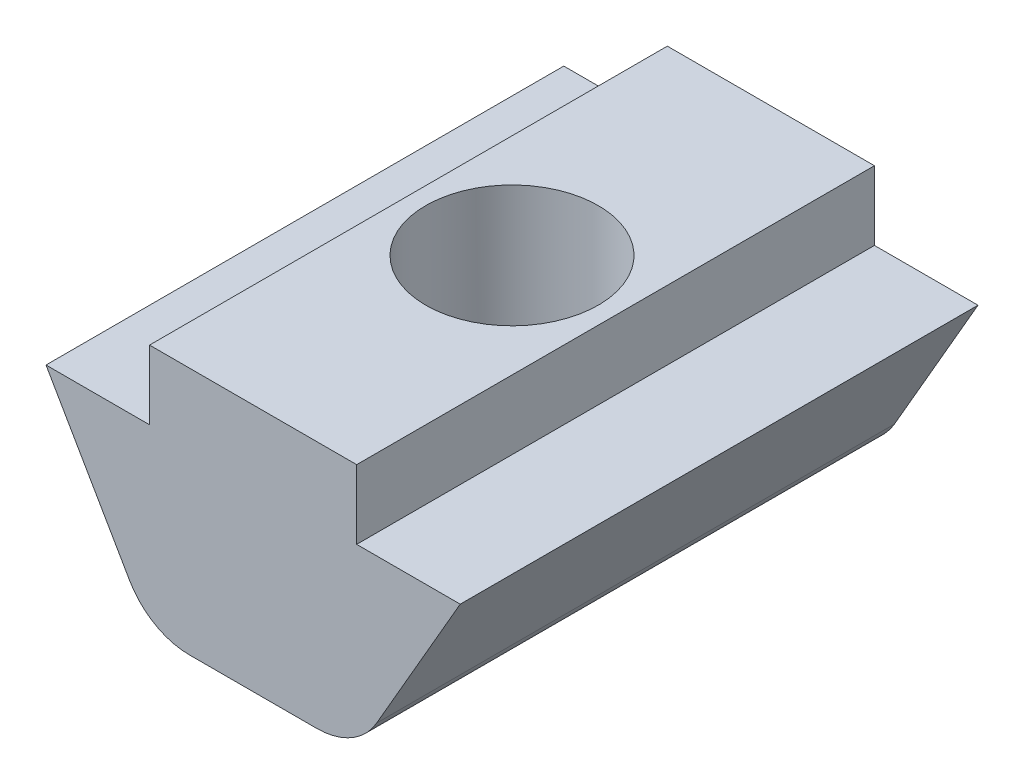
ISO-10303-21;
HEADER;
FILE_DESCRIPTION(('STEP AP214'),'2;1');
FILE_NAME('part.step','',(''),(''),'','','');
FILE_SCHEMA(('AUTOMOTIVE_DESIGN { 1 0 10303 214 1 1 1 1 }'));
ENDSEC;
DATA;
#1=APPLICATION_CONTEXT('core data for automotive mechanical design processes');
#2=APPLICATION_PROTOCOL_DEFINITION('international standard','automotive_design',2000,#1);
#3=PRODUCT_CONTEXT('',#1,'mechanical');
#4=PRODUCT('Part','Part','',(#3));
#5=PRODUCT_RELATED_PRODUCT_CATEGORY('part','',(#4));
#6=PRODUCT_DEFINITION_FORMATION('','',#4);
#7=PRODUCT_DEFINITION_CONTEXT('part definition',#1,'design');
#8=PRODUCT_DEFINITION('design','',#6,#7);
#9=PRODUCT_DEFINITION_SHAPE('','',#8);
#10=(LENGTH_UNIT() NAMED_UNIT(*) SI_UNIT(.MILLI.,.METRE.));
#11=(NAMED_UNIT(*) PLANE_ANGLE_UNIT() SI_UNIT($,.RADIAN.));
#12=(NAMED_UNIT(*) SI_UNIT($,.STERADIAN.) SOLID_ANGLE_UNIT());
#13=UNCERTAINTY_MEASURE_WITH_UNIT(LENGTH_MEASURE(1.E-05),#10,'distance_accuracy_value','');
#14=(GEOMETRIC_REPRESENTATION_CONTEXT(3) GLOBAL_UNCERTAINTY_ASSIGNED_CONTEXT((#13)) GLOBAL_UNIT_ASSIGNED_CONTEXT((#10,
#11,#12)) REPRESENTATION_CONTEXT('',''));
#15=CARTESIAN_POINT('',(0.,0.,0.));
#16=DIRECTION('',(0.,0.,1.));
#17=DIRECTION('',(1.,0.,0.));
#18=AXIS2_PLACEMENT_3D('',#15,#16,#17);
#19=CARTESIAN_POINT('',(0.,0.,7.5));
#20=DIRECTION('',(0.,1.,0.));
#21=DIRECTION('',(0.,0.,1.));
#22=AXIS2_PLACEMENT_3D('',#19,#20,#21);
#23=PLANE('',#22);
#24=DIRECTION('',(1.,0.,0.));
#25=VECTOR('',#24,1.);
#26=CARTESIAN_POINT('',(0.,0.,-7.5));
#27=LINE('',#26,#25);
#28=CARTESIAN_POINT('',(-1.84529946162075,0.,-7.5));
#29=VERTEX_POINT('',#28);
#30=CARTESIAN_POINT('',(1.84529946162075,0.,-7.5));
#31=VERTEX_POINT('',#30);
#32=EDGE_CURVE('E165',#29,#31,#27,.T.);
#33=ORIENTED_EDGE('',*,*,#32,.T.);
#34=DIRECTION('',(0.,0.,-1.));
#35=VECTOR('',#34,1.);
#36=CARTESIAN_POINT('',(1.84529946162075,0.,7.5));
#37=LINE('',#36,#35);
#38=CARTESIAN_POINT('',(1.84529946162075,0.,-1.68667421185662));
#39=VERTEX_POINT('',#38);
#40=EDGE_CURVE('E222',#31,#39,#37,.F.);
#41=ORIENTED_EDGE('',*,*,#40,.T.);
#42=CARTESIAN_POINT('',(0.,0.,0.));
#43=DIRECTION('',(0.,1.,0.));
#44=DIRECTION('',(0.,0.,1.));
#45=AXIS2_PLACEMENT_3D('',#42,#43,#44);
#46=CIRCLE('',#45,2.5);
#47=CARTESIAN_POINT('',(-1.84529946162075,0.,-1.68667421185662));
#48=VERTEX_POINT('',#47);
#49=EDGE_CURVE('E186',#39,#48,#46,.T.);
#50=ORIENTED_EDGE('',*,*,#49,.T.);
#51=DIRECTION('',(0.,0.,-1.));
#52=VECTOR('',#51,1.);
#53=CARTESIAN_POINT('',(-1.84529946162075,0.,-7.5));
#54=LINE('',#53,#52);
#55=EDGE_CURVE('E216',#48,#29,#54,.T.);
#56=ORIENTED_EDGE('',*,*,#55,.T.);
#57=EDGE_LOOP('',(#33,#41,#50,#56));
#58=FACE_BOUND('',#57,.T.);
#59=ADVANCED_FACE('F47',(#58),#23,.F.);
#60=CARTESIAN_POINT('',(0.,5.19615242270662,7.5));
#61=DIRECTION('',(0.,1.,0.));
#62=DIRECTION('',(-1.,0.,0.));
#63=AXIS2_PLACEMENT_3D('',#60,#61,#62);
#64=PLANE('',#63);
#65=DIRECTION('',(1.,0.,0.));
#66=VECTOR('',#65,1.);
#67=CARTESIAN_POINT('',(0.,5.19615242270662,-7.5));
#68=LINE('',#67,#66);
#69=CARTESIAN_POINT('',(3.,5.19615242270662,-7.5));
#70=VERTEX_POINT('',#69);
#71=CARTESIAN_POINT('',(6.00000000000002,5.19615242270662,-7.5));
#72=VERTEX_POINT('',#71);
#73=EDGE_CURVE('E145',#70,#72,#68,.T.);
#74=ORIENTED_EDGE('',*,*,#73,.F.);
#75=DIRECTION('',(0.,0.,-1.));
#76=VECTOR('',#75,1.);
#77=CARTESIAN_POINT('',(3.,5.19615242270662,7.5));
#78=LINE('',#77,#76);
#79=CARTESIAN_POINT('',(3.,5.19615242270662,7.5));
#80=VERTEX_POINT('',#79);
#81=EDGE_CURVE('E138',#80,#70,#78,.T.);
#82=ORIENTED_EDGE('',*,*,#81,.F.);
#83=DIRECTION('',(1.,0.,0.));
#84=VECTOR('',#83,1.);
#85=CARTESIAN_POINT('',(0.,5.19615242270662,7.5));
#86=LINE('',#85,#84);
#87=CARTESIAN_POINT('',(6.00000000000002,5.19615242270662,7.5));
#88=VERTEX_POINT('',#87);
#89=EDGE_CURVE('E143',#80,#88,#86,.T.);
#90=ORIENTED_EDGE('',*,*,#89,.T.);
#91=DIRECTION('',(0.,0.,-1.));
#92=VECTOR('',#91,1.);
#93=CARTESIAN_POINT('',(6.00000000000002,5.19615242270662,7.5));
#94=LINE('',#93,#92);
#95=EDGE_CURVE('E183',#88,#72,#94,.T.);
#96=ORIENTED_EDGE('',*,*,#95,.T.);
#97=EDGE_LOOP('',(#74,#82,#90,#96));
#98=FACE_BOUND('',#97,.T.);
#99=ADVANCED_FACE('F140',(#98),#64,.T.);
#100=CARTESIAN_POINT('',(3.,0.,7.5));
#101=DIRECTION('',(-1.,0.,0.));
#102=DIRECTION('',(0.,-1.,0.));
#103=AXIS2_PLACEMENT_3D('',#100,#101,#102);
#104=PLANE('',#103);
#105=DIRECTION('',(0.,1.,0.));
#106=VECTOR('',#105,1.);
#107=CARTESIAN_POINT('',(3.,0.,-7.5));
#108=LINE('',#107,#106);
#109=CARTESIAN_POINT('',(3.,7.19615242270662,-7.5));
#110=VERTEX_POINT('',#109);
#111=EDGE_CURVE('E185',#70,#110,#108,.T.);
#112=ORIENTED_EDGE('',*,*,#111,.T.);
#113=DIRECTION('',(0.,0.,-1.));
#114=VECTOR('',#113,1.);
#115=CARTESIAN_POINT('',(3.,7.19615242270662,7.5));
#116=LINE('',#115,#114);
#117=CARTESIAN_POINT('',(3.,7.19615242270662,7.5));
#118=VERTEX_POINT('',#117);
#119=EDGE_CURVE('E149',#118,#110,#116,.T.);
#120=ORIENTED_EDGE('',*,*,#119,.F.);
#121=DIRECTION('',(0.,1.,0.));
#122=VECTOR('',#121,1.);
#123=CARTESIAN_POINT('',(3.,0.,7.5));
#124=LINE('',#123,#122);
#125=EDGE_CURVE('E152',#80,#118,#124,.T.);
#126=ORIENTED_EDGE('',*,*,#125,.F.);
#127=ORIENTED_EDGE('',*,*,#81,.T.);
#128=EDGE_LOOP('',(#112,#120,#126,#127));
#129=FACE_BOUND('',#128,.T.);
#130=ADVANCED_FACE('F153',(#129),#104,.F.);
#131=CARTESIAN_POINT('',(0.,7.19615242270662,7.5));
#132=DIRECTION('',(0.,-1.,0.));
#133=DIRECTION('',(1.,0.,0.));
#134=AXIS2_PLACEMENT_3D('',#131,#132,#133);
#135=PLANE('',#134);
#136=CARTESIAN_POINT('',(0.,7.19615242270662,0.));
#137=DIRECTION('',(0.,1.,0.));
#138=DIRECTION('',(0.,0.,1.));
#139=AXIS2_PLACEMENT_3D('',#136,#137,#138);
#140=CIRCLE('',#139,2.5);
#141=CARTESIAN_POINT('',(0.,7.19615242270662,2.5));
#142=VERTEX_POINT('',#141);
#143=EDGE_CURVE('E311',#142,#142,#140,.T.);
#144=ORIENTED_EDGE('',*,*,#143,.F.);
#145=EDGE_LOOP('',(#144));
#146=FACE_BOUND('',#145,.T.);
#147=DIRECTION('',(-1.,0.,0.));
#148=VECTOR('',#147,1.);
#149=CARTESIAN_POINT('',(0.,7.19615242270662,-7.5));
#150=LINE('',#149,#148);
#151=CARTESIAN_POINT('',(-3.,7.19615242270662,-7.5));
#152=VERTEX_POINT('',#151);
#153=EDGE_CURVE('E188',#110,#152,#150,.T.);
#154=ORIENTED_EDGE('',*,*,#153,.T.);
#155=DIRECTION('',(0.,0.,-1.));
#156=VECTOR('',#155,1.);
#157=CARTESIAN_POINT('',(-3.,7.19615242270662,7.5));
#158=LINE('',#157,#156);
#159=CARTESIAN_POINT('',(-3.,7.19615242270662,7.5));
#160=VERTEX_POINT('',#159);
#161=EDGE_CURVE('E207',#160,#152,#158,.T.);
#162=ORIENTED_EDGE('',*,*,#161,.F.);
#163=DIRECTION('',(-1.,0.,0.));
#164=VECTOR('',#163,1.);
#165=CARTESIAN_POINT('',(0.,7.19615242270662,7.5));
#166=LINE('',#165,#164);
#167=EDGE_CURVE('E157',#118,#160,#166,.T.);
#168=ORIENTED_EDGE('',*,*,#167,.F.);
#169=ORIENTED_EDGE('',*,*,#119,.T.);
#170=EDGE_LOOP('',(#154,#162,#168,#169));
#171=FACE_BOUND('',#170,.T.);
#172=ADVANCED_FACE('F267',(#146,#171),#135,.F.);
#173=CARTESIAN_POINT('',(-3.,0.,7.5));
#174=DIRECTION('',(-1.,0.,0.));
#175=DIRECTION('',(0.,0.,1.));
#176=AXIS2_PLACEMENT_3D('',#173,#174,#175);
#177=PLANE('',#176);
#178=DIRECTION('',(0.,1.,0.));
#179=VECTOR('',#178,1.);
#180=CARTESIAN_POINT('',(-3.,0.,-7.5));
#181=LINE('',#180,#179);
#182=CARTESIAN_POINT('',(-3.,5.19615242270662,-7.5));
#183=VERTEX_POINT('',#182);
#184=EDGE_CURVE('E191',#183,#152,#181,.T.);
#185=ORIENTED_EDGE('',*,*,#184,.F.);
#186=DIRECTION('',(0.,0.,-1.));
#187=VECTOR('',#186,1.);
#188=CARTESIAN_POINT('',(-3.,5.19615242270662,7.5));
#189=LINE('',#188,#187);
#190=CARTESIAN_POINT('',(-3.,5.19615242270662,7.5));
#191=VERTEX_POINT('',#190);
#192=EDGE_CURVE('E205',#191,#183,#189,.T.);
#193=ORIENTED_EDGE('',*,*,#192,.F.);
#194=DIRECTION('',(0.,1.,0.));
#195=VECTOR('',#194,1.);
#196=CARTESIAN_POINT('',(-3.,0.,7.5));
#197=LINE('',#196,#195);
#198=EDGE_CURVE('E172',#191,#160,#197,.T.);
#199=ORIENTED_EDGE('',*,*,#198,.T.);
#200=ORIENTED_EDGE('',*,*,#161,.T.);
#201=EDGE_LOOP('',(#185,#193,#199,#200));
#202=FACE_BOUND('',#201,.T.);
#203=ADVANCED_FACE('F263',(#202),#177,.T.);
#204=CARTESIAN_POINT('',(0.,5.19615242270662,7.5));
#205=DIRECTION('',(0.,1.,0.));
#206=DIRECTION('',(-1.,0.,0.));
#207=AXIS2_PLACEMENT_3D('',#204,#205,#206);
#208=PLANE('',#207);
#209=DIRECTION('',(1.,0.,0.));
#210=VECTOR('',#209,1.);
#211=CARTESIAN_POINT('',(0.,5.19615242270662,-7.5));
#212=LINE('',#211,#210);
#213=CARTESIAN_POINT('',(-6.00000000000002,5.19615242270662,-7.5));
#214=VERTEX_POINT('',#213);
#215=EDGE_CURVE('E194',#214,#183,#212,.T.);
#216=ORIENTED_EDGE('',*,*,#215,.F.);
#217=DIRECTION('',(0.,0.,-1.));
#218=VECTOR('',#217,1.);
#219=CARTESIAN_POINT('',(-6.00000000000002,5.19615242270662,7.5));
#220=LINE('',#219,#218);
#221=CARTESIAN_POINT('',(-6.00000000000002,5.19615242270662,7.5));
#222=VERTEX_POINT('',#221);
#223=EDGE_CURVE('E202',#222,#214,#220,.T.);
#224=ORIENTED_EDGE('',*,*,#223,.F.);
#225=DIRECTION('',(1.,0.,0.));
#226=VECTOR('',#225,1.);
#227=CARTESIAN_POINT('',(0.,5.19615242270662,7.5));
#228=LINE('',#227,#226);
#229=EDGE_CURVE('E175',#222,#191,#228,.T.);
#230=ORIENTED_EDGE('',*,*,#229,.T.);
#231=ORIENTED_EDGE('',*,*,#192,.T.);
#232=EDGE_LOOP('',(#216,#224,#230,#231));
#233=FACE_BOUND('',#232,.T.);
#234=ADVANCED_FACE('F260',(#233),#208,.T.);
#235=CARTESIAN_POINT('',(-2.24999999999999,-1.29903810567666,7.5));
#236=DIRECTION('',(-0.866025403784436,-0.500000000000004,0.));
#237=DIRECTION('',(0.500000000000004,-0.866025403784436,0.));
#238=AXIS2_PLACEMENT_3D('',#235,#236,#237);
#239=PLANE('',#238);
#240=DIRECTION('',(-0.500000000000004,0.866025403784436,0.));
#241=VECTOR('',#240,1.);
#242=CARTESIAN_POINT('',(-2.24999999999999,-1.29903810567666,-7.5));
#243=LINE('',#242,#241);
#244=CARTESIAN_POINT('',(-3.57735026918963,0.999999999999992,-7.5));
#245=VERTEX_POINT('',#244);
#246=EDGE_CURVE('E197',#245,#214,#243,.T.);
#247=ORIENTED_EDGE('',*,*,#246,.F.);
#248=DIRECTION('',(0.,0.,-1.));
#249=VECTOR('',#248,1.);
#250=CARTESIAN_POINT('',(-3.57735026918963,0.999999999999992,7.5));
#251=LINE('',#250,#249);
#252=CARTESIAN_POINT('',(-3.57735026918963,0.999999999999992,7.5));
#253=VERTEX_POINT('',#252);
#254=EDGE_CURVE('E11',#245,#253,#251,.F.);
#255=ORIENTED_EDGE('',*,*,#254,.T.);
#256=DIRECTION('',(-0.500000000000004,0.866025403784436,0.));
#257=VECTOR('',#256,1.);
#258=CARTESIAN_POINT('',(-2.24999999999999,-1.29903810567666,7.5));
#259=LINE('',#258,#257);
#260=EDGE_CURVE('E178',#253,#222,#259,.T.);
#261=ORIENTED_EDGE('',*,*,#260,.T.);
#262=ORIENTED_EDGE('',*,*,#223,.T.);
#263=EDGE_LOOP('',(#247,#255,#261,#262));
#264=FACE_BOUND('',#263,.T.);
#265=ADVANCED_FACE('F257',(#264),#239,.T.);
#266=CARTESIAN_POINT('',(-1.84529946162075,0.,1.68667421185662));
#267=VERTEX_POINT('',#266);
#268=CARTESIAN_POINT('',(1.84529946162075,0.,1.68667421185662));
#269=VERTEX_POINT('',#268);
#270=EDGE_CURVE('E168',#267,#269,#46,.T.);
#271=ORIENTED_EDGE('',*,*,#270,.T.);
#272=DIRECTION('',(0.,0.,-1.));
#273=VECTOR('',#272,1.);
#274=CARTESIAN_POINT('',(1.84529946162075,0.,7.5));
#275=LINE('',#274,#273);
#276=CARTESIAN_POINT('',(1.84529946162075,0.,7.5));
#277=VERTEX_POINT('',#276);
#278=EDGE_CURVE('E69',#269,#277,#275,.F.);
#279=ORIENTED_EDGE('',*,*,#278,.T.);
#280=DIRECTION('',(1.,0.,0.));
#281=VECTOR('',#280,1.);
#282=CARTESIAN_POINT('',(0.,0.,7.5));
#283=LINE('',#282,#281);
#284=CARTESIAN_POINT('',(-1.84529946162075,0.,7.5));
#285=VERTEX_POINT('',#284);
#286=EDGE_CURVE('E180',#285,#277,#283,.T.);
#287=ORIENTED_EDGE('',*,*,#286,.F.);
#288=DIRECTION('',(0.,0.,-1.));
#289=VECTOR('',#288,1.);
#290=CARTESIAN_POINT('',(-1.84529946162075,0.,-7.5));
#291=LINE('',#290,#289);
#292=EDGE_CURVE('E218',#285,#267,#291,.T.);
#293=ORIENTED_EDGE('',*,*,#292,.T.);
#294=EDGE_LOOP('',(#271,#279,#287,#293));
#295=FACE_BOUND('',#294,.T.);
#296=ADVANCED_FACE('F253',(#295),#23,.F.);
#297=CARTESIAN_POINT('',(2.24999999999999,-1.29903810567666,7.5));
#298=DIRECTION('',(-0.866025403784436,0.500000000000004,0.));
#299=DIRECTION('',(-0.500000000000004,-0.866025403784436,0.));
#300=AXIS2_PLACEMENT_3D('',#297,#298,#299);
#301=PLANE('',#300);
#302=DIRECTION('',(0.500000000000004,0.866025403784436,0.));
#303=VECTOR('',#302,1.);
#304=CARTESIAN_POINT('',(2.24999999999999,-1.29903810567666,7.5));
#305=LINE('',#304,#303);
#306=CARTESIAN_POINT('',(3.57735026918963,0.999999999999993,7.5));
#307=VERTEX_POINT('',#306);
#308=EDGE_CURVE('E161',#307,#88,#305,.T.);
#309=ORIENTED_EDGE('',*,*,#308,.F.);
#310=DIRECTION('',(0.,0.,-1.));
#311=VECTOR('',#310,1.);
#312=CARTESIAN_POINT('',(3.57735026918963,0.999999999999992,7.5));
#313=LINE('',#312,#311);
#314=CARTESIAN_POINT('',(3.57735026918963,0.999999999999993,-7.5));
#315=VERTEX_POINT('',#314);
#316=EDGE_CURVE('E148',#307,#315,#313,.T.);
#317=ORIENTED_EDGE('',*,*,#316,.T.);
#318=DIRECTION('',(0.500000000000004,0.866025403784436,0.));
#319=VECTOR('',#318,1.);
#320=CARTESIAN_POINT('',(2.24999999999999,-1.29903810567666,-7.5));
#321=LINE('',#320,#319);
#322=EDGE_CURVE('E163',#315,#72,#321,.T.);
#323=ORIENTED_EDGE('',*,*,#322,.T.);
#324=ORIENTED_EDGE('',*,*,#95,.F.);
#325=EDGE_LOOP('',(#309,#317,#323,#324));
#326=FACE_BOUND('',#325,.T.);
#327=ADVANCED_FACE('F247',(#326),#301,.F.);
#328=CARTESIAN_POINT('',(0.,0.,7.5));
#329=DIRECTION('',(0.,0.,1.));
#330=DIRECTION('',(1.,0.,0.));
#331=AXIS2_PLACEMENT_3D('',#328,#329,#330);
#332=PLANE('',#331);
#333=ORIENTED_EDGE('',*,*,#286,.T.);
#334=CARTESIAN_POINT('',(1.84529946162075,2.,7.5));
#335=DIRECTION('',(0.,0.,1.));
#336=DIRECTION('',(1.,0.,0.));
#337=AXIS2_PLACEMENT_3D('',#334,#335,#336);
#338=CIRCLE('',#337,2.);
#339=EDGE_CURVE('E56',#277,#307,#338,.T.);
#340=ORIENTED_EDGE('',*,*,#339,.T.);
#341=ORIENTED_EDGE('',*,*,#308,.T.);
#342=ORIENTED_EDGE('',*,*,#89,.F.);
#343=ORIENTED_EDGE('',*,*,#125,.T.);
#344=ORIENTED_EDGE('',*,*,#167,.T.);
#345=ORIENTED_EDGE('',*,*,#198,.F.);
#346=ORIENTED_EDGE('',*,*,#229,.F.);
#347=ORIENTED_EDGE('',*,*,#260,.F.);
#348=CARTESIAN_POINT('',(-1.84529946162075,2.,7.5));
#349=DIRECTION('',(0.,0.,1.));
#350=DIRECTION('',(1.,0.,0.));
#351=AXIS2_PLACEMENT_3D('',#348,#349,#350);
#352=CIRCLE('',#351,2.);
#353=EDGE_CURVE('E298',#253,#285,#352,.T.);
#354=ORIENTED_EDGE('',*,*,#353,.T.);
#355=EDGE_LOOP('',(#333,#340,#341,#342,#343,#344,#345,#346,#347,#354));
#356=FACE_BOUND('',#355,.T.);
#357=ADVANCED_FACE('F159',(#356),#332,.T.);
#358=CARTESIAN_POINT('',(0.,0.,-7.5));
#359=DIRECTION('',(0.,0.,1.));
#360=DIRECTION('',(1.,0.,0.));
#361=AXIS2_PLACEMENT_3D('',#358,#359,#360);
#362=PLANE('',#361);
#363=ORIENTED_EDGE('',*,*,#322,.F.);
#364=CARTESIAN_POINT('',(1.84529946162075,2.,-7.5));
#365=DIRECTION('',(0.,0.,1.));
#366=DIRECTION('',(1.,0.,0.));
#367=AXIS2_PLACEMENT_3D('',#364,#365,#366);
#368=CIRCLE('',#367,2.);
#369=EDGE_CURVE('E214',#315,#31,#368,.F.);
#370=ORIENTED_EDGE('',*,*,#369,.T.);
#371=ORIENTED_EDGE('',*,*,#32,.F.);
#372=CARTESIAN_POINT('',(-1.84529946162075,2.,-7.5));
#373=DIRECTION('',(0.,0.,1.));
#374=DIRECTION('',(1.,0.,0.));
#375=AXIS2_PLACEMENT_3D('',#372,#373,#374);
#376=CIRCLE('',#375,2.);
#377=EDGE_CURVE('E212',#29,#245,#376,.F.);
#378=ORIENTED_EDGE('',*,*,#377,.T.);
#379=ORIENTED_EDGE('',*,*,#246,.T.);
#380=ORIENTED_EDGE('',*,*,#215,.T.);
#381=ORIENTED_EDGE('',*,*,#184,.T.);
#382=ORIENTED_EDGE('',*,*,#153,.F.);
#383=ORIENTED_EDGE('',*,*,#111,.F.);
#384=ORIENTED_EDGE('',*,*,#73,.T.);
#385=EDGE_LOOP('',(#363,#370,#371,#378,#379,#380,#381,#382,#383,#384));
#386=FACE_BOUND('',#385,.T.);
#387=ADVANCED_FACE('F242',(#386),#362,.F.);
#388=CARTESIAN_POINT('',(0.,7.19615242270662,0.));
#389=DIRECTION('',(0.,1.,0.));
#390=DIRECTION('',(0.,0.,1.));
#391=AXIS2_PLACEMENT_3D('',#388,#389,#390);
#392=CYLINDRICAL_SURFACE('',#391,2.5);
#393=ORIENTED_EDGE('',*,*,#49,.F.);
#394=CARTESIAN_POINT('',(1.84529946162075,0.,-1.68667421185662));
#395=CARTESIAN_POINT('',(1.89166208323592,6.02253034148748E-06,-1.63596244512052));
#396=CARTESIAN_POINT('',(1.93589660748271,0.00161163772368976,-1.58335834786107));
#397=CARTESIAN_POINT('',(2.01980908200873,0.00718323127973132,-1.47480981559388));
#398=CARTESIAN_POINT('',(2.0594905410737,0.0111473772857666,-1.41886800400017));
#399=CARTESIAN_POINT('',(2.13408202895476,0.0206014322045704,-1.30398878641697));
#400=CARTESIAN_POINT('',(2.16899042167147,0.0260918623468122,-1.24505036270606));
#401=CARTESIAN_POINT('',(2.23383052337675,0.0378263561087073,-1.12458415115544));
#402=CARTESIAN_POINT('',(2.26376126032835,0.0440705665167027,-1.06305586049909));
#403=CARTESIAN_POINT('',(2.34573911107062,0.0628025924692854,-0.875267125826667));
#404=CARTESIAN_POINT('',(2.39015429797694,0.0753199553636141,-0.745521279566222));
#405=CARTESIAN_POINT('',(2.44043963674816,0.0905241384865065,-0.546759724949087));
#406=CARTESIAN_POINT('',(2.45447855824454,0.0949969116781946,-0.479814834995023));
#407=CARTESIAN_POINT('',(2.47703347102168,0.102354713803054,-0.344920949647073));
#408=CARTESIAN_POINT('',(2.48555203999688,0.105240483682167,-0.276972438070001));
#409=CARTESIAN_POINT('',(2.49705711156809,0.109167150133622,-0.139689126563732));
#410=CARTESIAN_POINT('',(2.49997200718607,0.110184159452673,-0.07034767875794));
#411=CARTESIAN_POINT('',(2.50002758950487,0.110203442754377,0.068339426252214));
#412=CARTESIAN_POINT('',(2.49716817303453,0.10920568073858,0.13768508350965));
#413=CARTESIAN_POINT('',(2.4856973549221,0.105289462119004,0.275898198810731));
#414=CARTESIAN_POINT('',(2.47708164180493,0.10236956585784,0.344765259289742));
#415=CARTESIAN_POINT('',(2.45417973905657,0.0949002747487914,0.481467878326858));
#416=CARTESIAN_POINT('',(2.43989150022439,0.0903502910895572,0.549303054911478));
#417=CARTESIAN_POINT('',(2.3898063345361,0.0752317111676149,0.746141620800277));
#418=CARTESIAN_POINT('',(2.34638077699403,0.0630090453448606,0.873149691266596));
#419=CARTESIAN_POINT('',(2.23987257271947,0.0385549560441308,1.11840252533905));
#420=CARTESIAN_POINT('',(2.17681981563771,0.0263235739097326,1.23666027786064));
#421=CARTESIAN_POINT('',(2.06636894848399,0.0118815071581746,1.40895557432785));
#422=CARTESIAN_POINT('',(2.02551438984066,0.00766209269895628,1.46708264648664));
#423=CARTESIAN_POINT('',(1.93896874268972,0.00172549239337327,1.57969819357611));
#424=CARTESIAN_POINT('',(1.89328016062795,7.01656213483229E-06,1.63418853048663));
#425=CARTESIAN_POINT('',(1.84529946162076,0.,1.68667421185662));
#426=B_SPLINE_CURVE_WITH_KNOTS('',3,(#394,#395,#396,#397,#398,#399,#400,#401,#402,#403,#404,
#405,#406,#407,#408,#409,#410,#411,#412,#413,#414,#415,#416,#417,#418,#419,#420,#421,#422,#423,
#424,#425),.UNSPECIFIED.,.F.,.F.,(4,2,2,2,2,2,2,2,2,2,2,2,2,2,2,4),(0.,0.205998426597717,
0.411837020388377,0.617745995060499,0.823695132555702,1.23459414978837,1.44004707713748,
1.64540400025623,1.85336809088125,2.06133589728824,2.26945964679068,2.47765864955023,
2.88015660068141,3.28204457440841,3.49529530786595,3.70843600750046),.UNSPECIFIED.);
#427=EDGE_CURVE('E231',#39,#269,#426,.T.);
#428=ORIENTED_EDGE('',*,*,#427,.T.);
#429=ORIENTED_EDGE('',*,*,#270,.F.);
#430=CARTESIAN_POINT('',(-1.84529946162075,0.,1.68667421185662));
#431=CARTESIAN_POINT('',(-1.89166208323592,6.02253034144555E-06,1.63596244512052));
#432=CARTESIAN_POINT('',(-1.93589660748271,0.00161163772368984,1.58335834786107));
#433=CARTESIAN_POINT('',(-2.01980908200873,0.0071832312797316,1.47480981559388));
#434=CARTESIAN_POINT('',(-2.0594905410737,0.0111473772857669,1.41886800400017));
#435=CARTESIAN_POINT('',(-2.13408202895476,0.0206014322045706,1.30398878641697));
#436=CARTESIAN_POINT('',(-2.16899042167147,0.0260918623468121,1.24505036270606));
#437=CARTESIAN_POINT('',(-2.23383052337675,0.0378263561087072,1.12458415115544));
#438=CARTESIAN_POINT('',(-2.26376126032835,0.0440705665167028,1.06305586049909));
#439=CARTESIAN_POINT('',(-2.34573911107062,0.0628025924692857,0.875267125826665));
#440=CARTESIAN_POINT('',(-2.39015429797694,0.0753199553636139,0.74552127956622));
#441=CARTESIAN_POINT('',(-2.44043963674816,0.0905241384865064,0.546759724949085));
#442=CARTESIAN_POINT('',(-2.45447855824453,0.0949969116781946,0.479814834995022));
#443=CARTESIAN_POINT('',(-2.47703347102168,0.102354713803054,0.344920949647072));
#444=CARTESIAN_POINT('',(-2.48555203999688,0.105240483682167,0.276972438069999));
#445=CARTESIAN_POINT('',(-2.49705711156809,0.109167150133622,0.13968912656373));
#446=CARTESIAN_POINT('',(-2.49997200718607,0.110184159452673,0.0703476787579383));
#447=CARTESIAN_POINT('',(-2.50002758950486,0.110203442754376,-0.0683394262522156));
#448=CARTESIAN_POINT('',(-2.49716817303453,0.109205680738579,-0.137685083509652));
#449=CARTESIAN_POINT('',(-2.4856973549221,0.105289462119003,-0.275898198810732));
#450=CARTESIAN_POINT('',(-2.47708164180493,0.10236956585784,-0.344765259289744));
#451=CARTESIAN_POINT('',(-2.45417973905657,0.0949002747487914,-0.48146787832686));
#452=CARTESIAN_POINT('',(-2.43989150022439,0.0903502910895571,-0.54930305491148));
#453=CARTESIAN_POINT('',(-2.3898063345361,0.0752317111676146,-0.746141620800278));
#454=CARTESIAN_POINT('',(-2.34638077699403,0.0630090453448602,-0.873149691266597));
#455=CARTESIAN_POINT('',(-2.23987257271947,0.0385549560441303,-1.11840252533905));
#456=CARTESIAN_POINT('',(-2.17681981563771,0.0263235739097318,-1.23666027786064));
#457=CARTESIAN_POINT('',(-2.06636894848399,0.0118815071581742,-1.40895557432785));
#458=CARTESIAN_POINT('',(-2.02551438984066,0.0076620926989562,-1.46708264648664));
#459=CARTESIAN_POINT('',(-1.93896874268972,0.00172549239337352,-1.57969819357611));
#460=CARTESIAN_POINT('',(-1.89328016062795,7.01656213510338E-06,-1.63418853048663));
#461=CARTESIAN_POINT('',(-1.84529946162075,0.,-1.68667421185662));
#462=B_SPLINE_CURVE_WITH_KNOTS('',3,(#430,#431,#432,#433,#434,#435,#436,#437,#438,#439,#440,
#441,#442,#443,#444,#445,#446,#447,#448,#449,#450,#451,#452,#453,#454,#455,#456,#457,#458,#459,
#460,#461),.UNSPECIFIED.,.F.,.F.,(4,2,2,2,2,2,2,2,2,2,2,2,2,2,2,4),(0.,0.205998426597717,
0.411837020388378,0.617745995060499,0.823695132555702,1.23459414978837,1.44004707713748,
1.64540400025623,1.85336809088125,2.06133589728824,2.26945964679068,2.47765864955023,
2.88015660068141,3.28204457440841,3.49529530786595,3.70843600750046),.UNSPECIFIED.);
#463=EDGE_CURVE('E224',#267,#48,#462,.T.);
#464=ORIENTED_EDGE('',*,*,#463,.T.);
#465=EDGE_LOOP('',(#393,#428,#429,#464));
#466=FACE_BOUND('',#465,.T.);
#467=ORIENTED_EDGE('',*,*,#143,.T.);
#468=EDGE_LOOP('',(#467));
#469=FACE_BOUND('',#468,.T.);
#470=ADVANCED_FACE('F237',(#466,#469),#392,.F.);
#471=CARTESIAN_POINT('',(1.84529946162075,2.,7.5));
#472=DIRECTION('',(0.,0.,-1.));
#473=DIRECTION('',(-1.,0.,0.));
#474=AXIS2_PLACEMENT_3D('',#471,#472,#473);
#475=CYLINDRICAL_SURFACE('',#474,2.);
#476=ORIENTED_EDGE('',*,*,#427,.F.);
#477=ORIENTED_EDGE('',*,*,#40,.F.);
#478=ORIENTED_EDGE('',*,*,#369,.F.);
#479=ORIENTED_EDGE('',*,*,#316,.F.);
#480=ORIENTED_EDGE('',*,*,#339,.F.);
#481=ORIENTED_EDGE('',*,*,#278,.F.);
#482=EDGE_LOOP('',(#476,#477,#478,#479,#480,#481));
#483=FACE_BOUND('',#482,.T.);
#484=ADVANCED_FACE('F241',(#483),#475,.T.);
#485=CARTESIAN_POINT('',(-1.84529946162075,2.,7.5));
#486=DIRECTION('',(0.,0.,1.));
#487=DIRECTION('',(1.,0.,0.));
#488=AXIS2_PLACEMENT_3D('',#485,#486,#487);
#489=CYLINDRICAL_SURFACE('',#488,2.);
#490=ORIENTED_EDGE('',*,*,#353,.F.);
#491=ORIENTED_EDGE('',*,*,#254,.F.);
#492=ORIENTED_EDGE('',*,*,#377,.F.);
#493=ORIENTED_EDGE('',*,*,#55,.F.);
#494=ORIENTED_EDGE('',*,*,#463,.F.);
#495=ORIENTED_EDGE('',*,*,#292,.F.);
#496=EDGE_LOOP('',(#490,#491,#492,#493,#494,#495));
#497=FACE_BOUND('',#496,.T.);
#498=ADVANCED_FACE('F49',(#497),#489,.T.);
#499=CLOSED_SHELL('',(#59,#99,#130,#172,#203,#234,#265,#296,#327,#357,#387,#470,#484,#498));
#500=MANIFOLD_SOLID_BREP('B2',#499);
#501=ADVANCED_BREP_SHAPE_REPRESENTATION('',(#18,#500),#14);
#502=SHAPE_DEFINITION_REPRESENTATION(#9,#501);
ENDSEC;
END-ISO-10303-21;
